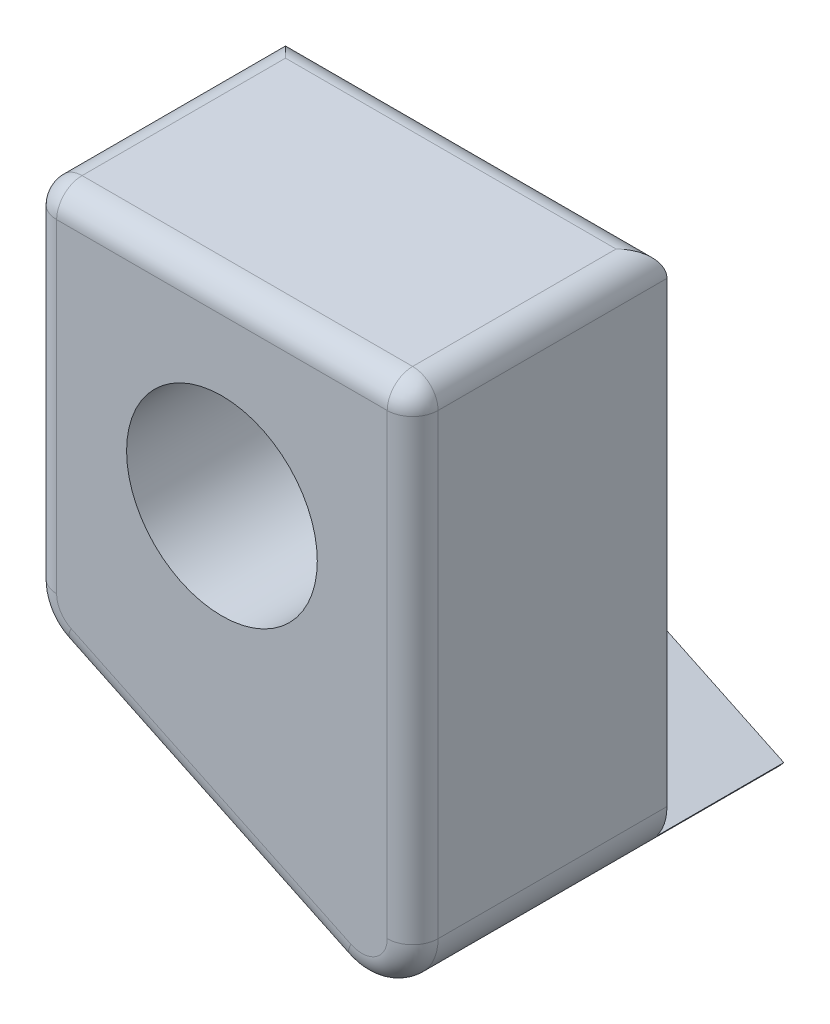
ISO-10303-21;
HEADER;
FILE_DESCRIPTION(('STEP AP214'),'2;1');
FILE_NAME('part.step','',(''),(''),'','','');
FILE_SCHEMA(('AUTOMOTIVE_DESIGN { 1 0 10303 214 1 1 1 1 }'));
ENDSEC;
DATA;
#1=APPLICATION_CONTEXT('core data for automotive mechanical design processes');
#2=APPLICATION_PROTOCOL_DEFINITION('international standard','automotive_design',2000,#1);
#3=PRODUCT_CONTEXT('',#1,'mechanical');
#4=PRODUCT('Part','Part','',(#3));
#5=PRODUCT_RELATED_PRODUCT_CATEGORY('part','',(#4));
#6=PRODUCT_DEFINITION_FORMATION('','',#4);
#7=PRODUCT_DEFINITION_CONTEXT('part definition',#1,'design');
#8=PRODUCT_DEFINITION('design','',#6,#7);
#9=PRODUCT_DEFINITION_SHAPE('','',#8);
#10=(LENGTH_UNIT() NAMED_UNIT(*) SI_UNIT(.MILLI.,.METRE.));
#11=(NAMED_UNIT(*) PLANE_ANGLE_UNIT() SI_UNIT($,.RADIAN.));
#12=(NAMED_UNIT(*) SI_UNIT($,.STERADIAN.) SOLID_ANGLE_UNIT());
#13=UNCERTAINTY_MEASURE_WITH_UNIT(LENGTH_MEASURE(1.E-05),#10,'distance_accuracy_value','');
#14=(GEOMETRIC_REPRESENTATION_CONTEXT(3) GLOBAL_UNCERTAINTY_ASSIGNED_CONTEXT((#13)) GLOBAL_UNIT_ASSIGNED_CONTEXT((#10,
#11,#12)) REPRESENTATION_CONTEXT('',''));
#15=CARTESIAN_POINT('',(0.,0.,0.));
#16=DIRECTION('',(0.,0.,1.));
#17=DIRECTION('',(1.,0.,0.));
#18=AXIS2_PLACEMENT_3D('',#15,#16,#17);
#19=CARTESIAN_POINT('',(0.,0.,10.));
#20=DIRECTION('',(0.,0.,-1.));
#21=DIRECTION('',(1.,0.,0.));
#22=AXIS2_PLACEMENT_3D('',#19,#20,#21);
#23=PLANE('',#22);
#24=CARTESIAN_POINT('',(0.,0.,10.));
#25=DIRECTION('',(0.,0.,1.));
#26=DIRECTION('',(1.,0.,0.));
#27=AXIS2_PLACEMENT_3D('',#24,#25,#26);
#28=CIRCLE('',#27,4.75);
#29=CARTESIAN_POINT('',(4.75,0.,10.));
#30=VERTEX_POINT('',#29);
#31=EDGE_CURVE('E232',#30,#30,#28,.F.);
#32=ORIENTED_EDGE('',*,*,#31,.F.);
#33=EDGE_LOOP('',(#32));
#34=FACE_BOUND('',#33,.T.);
#35=DIRECTION('',(0.,1.,0.));
#36=VECTOR('',#35,1.);
#37=CARTESIAN_POINT('',(7.5,7.5,10.));
#38=LINE('',#37,#36);
#39=CARTESIAN_POINT('',(7.5,-11.488406702993,10.));
#40=VERTEX_POINT('',#39);
#41=CARTESIAN_POINT('',(7.5,6.5,10.));
#42=VERTEX_POINT('',#41);
#43=EDGE_CURVE('E169',#40,#42,#38,.T.);
#44=ORIENTED_EDGE('',*,*,#43,.F.);
#45=CARTESIAN_POINT('',(5.5,-11.488406702993,10.));
#46=DIRECTION('',(0.,0.,1.));
#47=DIRECTION('',(1.,0.,0.));
#48=AXIS2_PLACEMENT_3D('',#45,#46,#47);
#49=CIRCLE('',#48,2.);
#50=CARTESIAN_POINT('',(7.09631730631528,-12.6933013280778,10.));
#51=VERTEX_POINT('',#50);
#52=EDGE_CURVE('E193',#51,#40,#49,.T.);
#53=ORIENTED_EDGE('',*,*,#52,.F.);
#54=DIRECTION('',(-0.902522036117792,0.430643674424453,0.));
#55=VECTOR('',#54,1.);
#56=CARTESIAN_POINT('',(-7.5,-5.72858305383451,10.));
#57=LINE('',#56,#55);
#58=CARTESIAN_POINT('',(-7.5,-5.72858305383451,10.));
#59=VERTEX_POINT('',#58);
#60=EDGE_CURVE('E150',#51,#59,#57,.T.);
#61=ORIENTED_EDGE('',*,*,#60,.T.);
#62=DIRECTION('',(0.,-1.,0.));
#63=VECTOR('',#62,1.);
#64=CARTESIAN_POINT('',(-7.5,0.,10.));
#65=LINE('',#64,#63);
#66=CARTESIAN_POINT('',(-7.5,6.5,10.));
#67=VERTEX_POINT('',#66);
#68=EDGE_CURVE('E164',#67,#59,#65,.T.);
#69=ORIENTED_EDGE('',*,*,#68,.F.);
#70=DIRECTION('',(-1.,0.,0.));
#71=VECTOR('',#70,1.);
#72=CARTESIAN_POINT('',(-7.5,6.5,10.));
#73=LINE('',#72,#71);
#74=EDGE_CURVE('E235',#42,#67,#73,.T.);
#75=ORIENTED_EDGE('',*,*,#74,.F.);
#76=EDGE_LOOP('',(#44,#53,#61,#69,#75));
#77=FACE_BOUND('',#76,.T.);
#78=ADVANCED_FACE('F41',(#34,#77),#23,.T.);
#79=CARTESIAN_POINT('',(0.,0.,20.));
#80=DIRECTION('',(0.,0.,-1.));
#81=DIRECTION('',(1.,0.,0.));
#82=AXIS2_PLACEMENT_3D('',#79,#80,#81);
#83=PLANE('',#82);
#84=DIRECTION('',(0.,-1.,0.));
#85=VECTOR('',#84,1.);
#86=CARTESIAN_POINT('',(-6.5,0.,20.));
#87=LINE('',#86,#85);
#88=CARTESIAN_POINT('',(-6.5,-6.23969229038362,20.));
#89=VERTEX_POINT('',#88);
#90=CARTESIAN_POINT('',(-6.5,6.5,20.));
#91=VERTEX_POINT('',#90);
#92=EDGE_CURVE('E208',#89,#91,#87,.F.);
#93=ORIENTED_EDGE('',*,*,#92,.F.);
#94=CARTESIAN_POINT('',(-5.5,-6.23969229038362,20.));
#95=DIRECTION('',(0.,0.,1.));
#96=DIRECTION('',(1.,0.,0.));
#97=AXIS2_PLACEMENT_3D('',#94,#95,#96);
#98=CIRCLE('',#97,1.);
#99=CARTESIAN_POINT('',(-5.93064367442445,-7.14221432650141,20.));
#100=VERTEX_POINT('',#99);
#101=EDGE_CURVE('E205',#100,#89,#98,.F.);
#102=ORIENTED_EDGE('',*,*,#101,.F.);
#103=DIRECTION('',(-0.902522036117792,0.430643674424453,0.));
#104=VECTOR('',#103,1.);
#105=CARTESIAN_POINT('',(-5.93064367442445,-7.14221432650141,20.));
#106=LINE('',#105,#104);
#107=CARTESIAN_POINT('',(5.06935632557555,-12.3909287391107,20.));
#108=VERTEX_POINT('',#107);
#109=EDGE_CURVE('E202',#108,#100,#106,.T.);
#110=ORIENTED_EDGE('',*,*,#109,.F.);
#111=CARTESIAN_POINT('',(5.5,-11.488406702993,20.));
#112=DIRECTION('',(0.,0.,1.));
#113=DIRECTION('',(1.,0.,0.));
#114=AXIS2_PLACEMENT_3D('',#111,#112,#113);
#115=CIRCLE('',#114,1.);
#116=CARTESIAN_POINT('',(6.5,-11.488406702993,20.));
#117=VERTEX_POINT('',#116);
#118=EDGE_CURVE('E211',#117,#108,#115,.F.);
#119=ORIENTED_EDGE('',*,*,#118,.F.);
#120=DIRECTION('',(0.,1.,0.));
#121=VECTOR('',#120,1.);
#122=CARTESIAN_POINT('',(6.5,0.,20.));
#123=LINE('',#122,#121);
#124=CARTESIAN_POINT('',(6.5,6.5,20.));
#125=VERTEX_POINT('',#124);
#126=EDGE_CURVE('E214',#125,#117,#123,.F.);
#127=ORIENTED_EDGE('',*,*,#126,.F.);
#128=DIRECTION('',(-1.,0.,0.));
#129=VECTOR('',#128,1.);
#130=CARTESIAN_POINT('',(0.,6.5,20.));
#131=LINE('',#130,#129);
#132=EDGE_CURVE('E217',#91,#125,#131,.F.);
#133=ORIENTED_EDGE('',*,*,#132,.F.);
#134=EDGE_LOOP('',(#93,#102,#110,#119,#127,#133));
#135=FACE_BOUND('',#134,.T.);
#136=CARTESIAN_POINT('',(0.,0.,20.));
#137=DIRECTION('',(0.,0.,1.));
#138=DIRECTION('',(1.,0.,0.));
#139=AXIS2_PLACEMENT_3D('',#136,#137,#138);
#140=CIRCLE('',#139,3.75);
#141=CARTESIAN_POINT('',(3.75,0.,20.));
#142=VERTEX_POINT('',#141);
#143=EDGE_CURVE('E166',#142,#142,#140,.T.);
#144=ORIENTED_EDGE('',*,*,#143,.F.);
#145=EDGE_LOOP('',(#144));
#146=FACE_BOUND('',#145,.T.);
#147=ADVANCED_FACE('F319',(#135,#146),#83,.F.);
#148=CARTESIAN_POINT('',(7.5,7.5,10.));
#149=DIRECTION('',(-1.,0.,0.));
#150=DIRECTION('',(0.,0.,-1.));
#151=AXIS2_PLACEMENT_3D('',#148,#149,#150);
#152=PLANE('',#151);
#153=DIRECTION('',(0.,0.,1.));
#154=VECTOR('',#153,1.);
#155=CARTESIAN_POINT('',(7.5,-11.488406702993,20.));
#156=LINE('',#155,#154);
#157=CARTESIAN_POINT('',(7.5,-11.488406702993,19.));
#158=VERTEX_POINT('',#157);
#159=EDGE_CURVE('E189',#40,#158,#156,.T.);
#160=ORIENTED_EDGE('',*,*,#159,.F.);
#161=ORIENTED_EDGE('',*,*,#43,.T.);
#162=DIRECTION('',(0.,0.,1.));
#163=VECTOR('',#162,1.);
#164=CARTESIAN_POINT('',(7.5,6.5,10.));
#165=LINE('',#164,#163);
#166=CARTESIAN_POINT('',(7.5,6.5,19.));
#167=VERTEX_POINT('',#166);
#168=EDGE_CURVE('E196',#167,#42,#165,.F.);
#169=ORIENTED_EDGE('',*,*,#168,.F.);
#170=DIRECTION('',(0.,1.,0.));
#171=VECTOR('',#170,1.);
#172=CARTESIAN_POINT('',(7.5,7.5,19.));
#173=LINE('',#172,#171);
#174=EDGE_CURVE('E199',#158,#167,#173,.T.);
#175=ORIENTED_EDGE('',*,*,#174,.F.);
#176=EDGE_LOOP('',(#160,#161,#169,#175));
#177=FACE_BOUND('',#176,.T.);
#178=ADVANCED_FACE('F325',(#177),#152,.F.);
#179=CARTESIAN_POINT('',(-7.5,7.5,10.));
#180=DIRECTION('',(0.,-1.,0.));
#181=DIRECTION('',(0.,0.,1.));
#182=AXIS2_PLACEMENT_3D('',#179,#180,#181);
#183=PLANE('',#182);
#184=DIRECTION('',(-1.,0.,0.));
#185=VECTOR('',#184,1.);
#186=CARTESIAN_POINT('',(-7.5,7.5,19.));
#187=LINE('',#186,#185);
#188=CARTESIAN_POINT('',(6.5,7.5,19.));
#189=VERTEX_POINT('',#188);
#190=CARTESIAN_POINT('',(-6.5,7.5,19.));
#191=VERTEX_POINT('',#190);
#192=EDGE_CURVE('E240',#189,#191,#187,.T.);
#193=ORIENTED_EDGE('',*,*,#192,.F.);
#194=DIRECTION('',(0.,0.,1.));
#195=VECTOR('',#194,1.);
#196=CARTESIAN_POINT('',(6.5,7.5,10.));
#197=LINE('',#196,#195);
#198=CARTESIAN_POINT('',(6.5,7.5,11.));
#199=VERTEX_POINT('',#198);
#200=EDGE_CURVE('E237',#199,#189,#197,.T.);
#201=ORIENTED_EDGE('',*,*,#200,.F.);
#202=DIRECTION('',(-1.,0.,0.));
#203=VECTOR('',#202,1.);
#204=CARTESIAN_POINT('',(7.5,7.5,11.));
#205=LINE('',#204,#203);
#206=CARTESIAN_POINT('',(-6.5,7.5,11.));
#207=VERTEX_POINT('',#206);
#208=EDGE_CURVE('E243',#207,#199,#205,.F.);
#209=ORIENTED_EDGE('',*,*,#208,.F.);
#210=DIRECTION('',(0.,0.,1.));
#211=VECTOR('',#210,1.);
#212=CARTESIAN_POINT('',(-6.5,7.5,10.));
#213=LINE('',#212,#211);
#214=EDGE_CURVE('E245',#191,#207,#213,.F.);
#215=ORIENTED_EDGE('',*,*,#214,.F.);
#216=EDGE_LOOP('',(#193,#201,#209,#215));
#217=FACE_BOUND('',#216,.T.);
#218=ADVANCED_FACE('F291',(#217),#183,.F.);
#219=CARTESIAN_POINT('',(-7.5,0.,10.));
#220=DIRECTION('',(1.,0.,0.));
#221=DIRECTION('',(0.,0.,1.));
#222=AXIS2_PLACEMENT_3D('',#219,#220,#221);
#223=PLANE('',#222);
#224=DIRECTION('',(0.,0.,1.));
#225=VECTOR('',#224,1.);
#226=CARTESIAN_POINT('',(-7.5,6.5,10.));
#227=LINE('',#226,#225);
#228=CARTESIAN_POINT('',(-7.5,6.5,19.));
#229=VERTEX_POINT('',#228);
#230=EDGE_CURVE('E223',#67,#229,#227,.T.);
#231=ORIENTED_EDGE('',*,*,#230,.F.);
#232=ORIENTED_EDGE('',*,*,#68,.T.);
#233=DIRECTION('',(0.,0.,1.));
#234=VECTOR('',#233,1.);
#235=CARTESIAN_POINT('',(-7.5,-5.72858305383451,5.));
#236=LINE('',#235,#234);
#237=CARTESIAN_POINT('',(-7.5,-5.72858305383451,5.));
#238=VERTEX_POINT('',#237);
#239=EDGE_CURVE('E145',#238,#59,#236,.T.);
#240=ORIENTED_EDGE('',*,*,#239,.F.);
#241=DIRECTION('',(0.,-1.,0.));
#242=VECTOR('',#241,1.);
#243=CARTESIAN_POINT('',(-7.5,-7.50139295317218,5.));
#244=LINE('',#243,#242);
#245=CARTESIAN_POINT('',(-7.5,-6.23969229038362,5.));
#246=VERTEX_POINT('',#245);
#247=EDGE_CURVE('E149',#238,#246,#244,.T.);
#248=ORIENTED_EDGE('',*,*,#247,.T.);
#249=DIRECTION('',(0.,0.,1.));
#250=VECTOR('',#249,1.);
#251=CARTESIAN_POINT('',(-7.5,-6.23969229038362,5.));
#252=LINE('',#251,#250);
#253=CARTESIAN_POINT('',(-7.5,-6.23969229038362,19.));
#254=VERTEX_POINT('',#253);
#255=EDGE_CURVE('E184',#254,#246,#252,.F.);
#256=ORIENTED_EDGE('',*,*,#255,.F.);
#257=DIRECTION('',(0.,-1.,0.));
#258=VECTOR('',#257,1.);
#259=CARTESIAN_POINT('',(-7.5,0.,19.));
#260=LINE('',#259,#258);
#261=EDGE_CURVE('E226',#229,#254,#260,.T.);
#262=ORIENTED_EDGE('',*,*,#261,.F.);
#263=EDGE_LOOP('',(#231,#232,#240,#248,#256,#262));
#264=FACE_BOUND('',#263,.T.);
#265=ADVANCED_FACE('F162',(#264),#223,.F.);
#266=CARTESIAN_POINT('',(0.,0.,10.));
#267=DIRECTION('',(0.,0.,1.));
#268=DIRECTION('',(-1.,0.,0.));
#269=AXIS2_PLACEMENT_3D('',#266,#267,#268);
#270=CYLINDRICAL_SURFACE('',#269,3.75);
#271=CARTESIAN_POINT('',(0.,0.,11.));
#272=DIRECTION('',(0.,0.,1.));
#273=DIRECTION('',(1.,0.,0.));
#274=AXIS2_PLACEMENT_3D('',#271,#272,#273);
#275=CIRCLE('',#274,3.75);
#276=CARTESIAN_POINT('',(3.75,0.,11.));
#277=VERTEX_POINT('',#276);
#278=EDGE_CURVE('E11',#277,#277,#275,.T.);
#279=ORIENTED_EDGE('',*,*,#278,.F.);
#280=EDGE_LOOP('',(#279));
#281=FACE_BOUND('',#280,.T.);
#282=ORIENTED_EDGE('',*,*,#143,.T.);
#283=EDGE_LOOP('',(#282));
#284=FACE_BOUND('',#283,.T.);
#285=ADVANCED_FACE('F330',(#281,#284),#270,.F.);
#286=CARTESIAN_POINT('',(7.5,-14.6587307885485,10.));
#287=DIRECTION('',(-0.430643674424453,-0.902522036117793,0.));
#288=DIRECTION('',(0.902522036117792,-0.430643674424453,0.));
#289=AXIS2_PLACEMENT_3D('',#286,#287,#288);
#290=PLANE('',#289);
#291=DIRECTION('',(0.,0.,1.));
#292=VECTOR('',#291,1.);
#293=CARTESIAN_POINT('',(-6.36128734884891,-8.0447363626192,20.));
#294=LINE('',#293,#292);
#295=CARTESIAN_POINT('',(-6.36128734884891,-8.0447363626192,5.));
#296=VERTEX_POINT('',#295);
#297=CARTESIAN_POINT('',(-6.36128734884891,-8.0447363626192,19.));
#298=VERTEX_POINT('',#297);
#299=EDGE_CURVE('E181',#296,#298,#294,.T.);
#300=ORIENTED_EDGE('',*,*,#299,.F.);
#301=DIRECTION('',(0.902522036117793,-0.430643674424453,0.));
#302=VECTOR('',#301,1.);
#303=CARTESIAN_POINT('',(7.5,-14.6587307885485,5.));
#304=LINE('',#303,#302);
#305=CARTESIAN_POINT('',(4.63871265115109,-13.2934507752285,5.));
#306=VERTEX_POINT('',#305);
#307=EDGE_CURVE('E159',#296,#306,#304,.T.);
#308=ORIENTED_EDGE('',*,*,#307,.T.);
#309=DIRECTION('',(0.,0.,1.));
#310=VECTOR('',#309,1.);
#311=CARTESIAN_POINT('',(4.63871265115109,-13.2934507752285,5.));
#312=LINE('',#311,#310);
#313=CARTESIAN_POINT('',(4.63871265115109,-13.2934507752285,19.));
#314=VERTEX_POINT('',#313);
#315=EDGE_CURVE('E178',#314,#306,#312,.F.);
#316=ORIENTED_EDGE('',*,*,#315,.F.);
#317=DIRECTION('',(-0.902522036117792,0.430643674424453,0.));
#318=VECTOR('',#317,1.);
#319=CARTESIAN_POINT('',(4.63871265115109,-13.2934507752285,19.));
#320=LINE('',#319,#318);
#321=EDGE_CURVE('E50',#298,#314,#320,.F.);
#322=ORIENTED_EDGE('',*,*,#321,.F.);
#323=EDGE_LOOP('',(#300,#308,#316,#322));
#324=FACE_BOUND('',#323,.T.);
#325=ADVANCED_FACE('F281',(#324),#290,.T.);
#326=CARTESIAN_POINT('',(-7.5,-5.72858305383451,5.));
#327=DIRECTION('',(-0.430643674424453,-0.902522036117792,0.));
#328=DIRECTION('',(0.902522036117793,-0.430643674424453,0.));
#329=AXIS2_PLACEMENT_3D('',#326,#327,#328);
#330=PLANE('',#329);
#331=DIRECTION('',(-0.902522036117792,0.430643674424453,0.));
#332=VECTOR('',#331,1.);
#333=CARTESIAN_POINT('',(-7.5,-5.72858305383451,5.));
#334=LINE('',#333,#332);
#335=CARTESIAN_POINT('',(7.09631730631527,-12.6933013280778,5.));
#336=VERTEX_POINT('',#335);
#337=EDGE_CURVE('E140',#336,#238,#334,.T.);
#338=ORIENTED_EDGE('',*,*,#337,.T.);
#339=ORIENTED_EDGE('',*,*,#239,.T.);
#340=ORIENTED_EDGE('',*,*,#60,.F.);
#341=DIRECTION('',(0.,0.,-1.));
#342=VECTOR('',#341,1.);
#343=CARTESIAN_POINT('',(7.09631730631528,-12.6933013280778,5.));
#344=LINE('',#343,#342);
#345=EDGE_CURVE('E147',#336,#51,#344,.F.);
#346=ORIENTED_EDGE('',*,*,#345,.F.);
#347=EDGE_LOOP('',(#338,#339,#340,#346));
#348=FACE_BOUND('',#347,.T.);
#349=ADVANCED_FACE('F142',(#348),#330,.F.);
#350=CARTESIAN_POINT('',(0.,0.,5.));
#351=DIRECTION('',(0.,0.,1.));
#352=DIRECTION('',(-1.,0.,0.));
#353=AXIS2_PLACEMENT_3D('',#350,#351,#352);
#354=PLANE('',#353);
#355=ORIENTED_EDGE('',*,*,#247,.F.);
#356=ORIENTED_EDGE('',*,*,#337,.F.);
#357=CARTESIAN_POINT('',(5.5,-11.488406702993,5.));
#358=DIRECTION('',(0.,0.,-1.));
#359=DIRECTION('',(-1.,0.,0.));
#360=AXIS2_PLACEMENT_3D('',#357,#358,#359);
#361=CIRCLE('',#360,2.);
#362=EDGE_CURVE('E186',#306,#336,#361,.F.);
#363=ORIENTED_EDGE('',*,*,#362,.F.);
#364=ORIENTED_EDGE('',*,*,#307,.F.);
#365=CARTESIAN_POINT('',(-5.5,-6.23969229038362,5.));
#366=DIRECTION('',(0.,0.,-1.));
#367=DIRECTION('',(-1.,0.,0.));
#368=AXIS2_PLACEMENT_3D('',#365,#366,#367);
#369=CIRCLE('',#368,2.);
#370=EDGE_CURVE('E155',#246,#296,#369,.F.);
#371=ORIENTED_EDGE('',*,*,#370,.F.);
#372=EDGE_LOOP('',(#355,#356,#363,#364,#371));
#373=FACE_BOUND('',#372,.T.);
#374=ADVANCED_FACE('F153',(#373),#354,.F.);
#375=CARTESIAN_POINT('',(-5.5,-6.23969229038362,10.));
#376=DIRECTION('',(0.,0.,-1.));
#377=DIRECTION('',(1.,0.,0.));
#378=AXIS2_PLACEMENT_3D('',#375,#376,#377);
#379=CYLINDRICAL_SURFACE('',#378,2.);
#380=ORIENTED_EDGE('',*,*,#255,.T.);
#381=ORIENTED_EDGE('',*,*,#370,.T.);
#382=ORIENTED_EDGE('',*,*,#299,.T.);
#383=CARTESIAN_POINT('',(-5.5,-6.23969229038362,19.));
#384=DIRECTION('',(0.,0.,1.));
#385=DIRECTION('',(1.,0.,0.));
#386=AXIS2_PLACEMENT_3D('',#383,#384,#385);
#387=CIRCLE('',#386,2.);
#388=EDGE_CURVE('E229',#254,#298,#387,.T.);
#389=ORIENTED_EDGE('',*,*,#388,.F.);
#390=EDGE_LOOP('',(#380,#381,#382,#389));
#391=FACE_BOUND('',#390,.T.);
#392=ADVANCED_FACE('F284',(#391),#379,.T.);
#393=CARTESIAN_POINT('',(5.5,-11.488406702993,10.));
#394=DIRECTION('',(0.,0.,-1.));
#395=DIRECTION('',(1.,0.,0.));
#396=AXIS2_PLACEMENT_3D('',#393,#394,#395);
#397=CYLINDRICAL_SURFACE('',#396,2.);
#398=ORIENTED_EDGE('',*,*,#315,.T.);
#399=ORIENTED_EDGE('',*,*,#362,.T.);
#400=ORIENTED_EDGE('',*,*,#345,.T.);
#401=ORIENTED_EDGE('',*,*,#52,.T.);
#402=ORIENTED_EDGE('',*,*,#159,.T.);
#403=CARTESIAN_POINT('',(5.5,-11.488406702993,19.));
#404=DIRECTION('',(0.,0.,1.));
#405=DIRECTION('',(1.,0.,0.));
#406=AXIS2_PLACEMENT_3D('',#403,#404,#405);
#407=CIRCLE('',#406,2.);
#408=EDGE_CURVE('E220',#314,#158,#407,.T.);
#409=ORIENTED_EDGE('',*,*,#408,.F.);
#410=EDGE_LOOP('',(#398,#399,#400,#401,#402,#409));
#411=FACE_BOUND('',#410,.T.);
#412=ADVANCED_FACE('F275',(#411),#397,.T.);
#413=CARTESIAN_POINT('',(-6.5,6.5,10.));
#414=DIRECTION('',(0.,0.,1.));
#415=DIRECTION('',(-1.,0.,0.));
#416=AXIS2_PLACEMENT_3D('',#413,#414,#415);
#417=CYLINDRICAL_SURFACE('',#416,1.);
#418=CARTESIAN_POINT('',(-6.5,6.5,19.));
#419=DIRECTION('',(0.,0.,-1.));
#420=DIRECTION('',(-1.,0.,0.));
#421=AXIS2_PLACEMENT_3D('',#418,#419,#420);
#422=CIRCLE('',#421,1.);
#423=EDGE_CURVE('E267',#229,#191,#422,.T.);
#424=ORIENTED_EDGE('',*,*,#423,.T.);
#425=ORIENTED_EDGE('',*,*,#214,.T.);
#426=CARTESIAN_POINT('',(-6.5,6.5,11.));
#427=DIRECTION('',(0.707106781186547,0.,-0.707106781186547));
#428=DIRECTION('',(0.707106781186547,0.,0.707106781186547));
#429=AXIS2_PLACEMENT_3D('',#426,#427,#428);
#430=ELLIPSE('',#429,1.41421356237309,1.);
#431=EDGE_CURVE('E58',#207,#67,#430,.F.);
#432=ORIENTED_EDGE('',*,*,#431,.T.);
#433=ORIENTED_EDGE('',*,*,#230,.T.);
#434=EDGE_LOOP('',(#424,#425,#432,#433));
#435=FACE_BOUND('',#434,.T.);
#436=ADVANCED_FACE('F286',(#435),#417,.T.);
#437=CARTESIAN_POINT('',(-6.5,0.,19.));
#438=DIRECTION('',(0.,-1.,0.));
#439=DIRECTION('',(0.,0.,1.));
#440=AXIS2_PLACEMENT_3D('',#437,#438,#439);
#441=CYLINDRICAL_SURFACE('',#440,1.);
#442=CARTESIAN_POINT('',(-6.5,6.5,19.));
#443=DIRECTION('',(0.,-1.,0.));
#444=DIRECTION('',(0.,0.,-1.));
#445=AXIS2_PLACEMENT_3D('',#442,#443,#444);
#446=CIRCLE('',#445,1.);
#447=EDGE_CURVE('E265',#91,#229,#446,.T.);
#448=ORIENTED_EDGE('',*,*,#447,.T.);
#449=ORIENTED_EDGE('',*,*,#261,.T.);
#450=CARTESIAN_POINT('',(-6.5,-6.23969229038362,19.));
#451=DIRECTION('',(0.,1.,0.));
#452=DIRECTION('',(0.,0.,1.));
#453=AXIS2_PLACEMENT_3D('',#450,#451,#452);
#454=CIRCLE('',#453,1.);
#455=EDGE_CURVE('E45',#254,#89,#454,.T.);
#456=ORIENTED_EDGE('',*,*,#455,.T.);
#457=ORIENTED_EDGE('',*,*,#92,.T.);
#458=EDGE_LOOP('',(#448,#449,#456,#457));
#459=FACE_BOUND('',#458,.T.);
#460=ADVANCED_FACE('F315',(#459),#441,.T.);
#461=CARTESIAN_POINT('',(-5.5,-6.23969229038362,19.));
#462=DIRECTION('',(0.,0.,-1.));
#463=DIRECTION('',(1.,0.,0.));
#464=AXIS2_PLACEMENT_3D('',#461,#462,#463);
#465=DEGENERATE_TOROIDAL_SURFACE('',#464,1.,1.,.T.);
#466=ORIENTED_EDGE('',*,*,#455,.F.);
#467=ORIENTED_EDGE('',*,*,#388,.T.);
#468=CARTESIAN_POINT('',(-5.93064367442445,-7.14221432650141,19.));
#469=DIRECTION('',(-0.902522036117793,0.430643674424453,0.));
#470=DIRECTION('',(0.430643674424453,0.902522036117793,0.));
#471=AXIS2_PLACEMENT_3D('',#468,#469,#470);
#472=CIRCLE('',#471,1.);
#473=EDGE_CURVE('E263',#298,#100,#472,.T.);
#474=ORIENTED_EDGE('',*,*,#473,.T.);
#475=ORIENTED_EDGE('',*,*,#101,.T.);
#476=EDGE_LOOP('',(#466,#467,#474,#475));
#477=FACE_BOUND('',#476,.T.);
#478=ADVANCED_FACE('F307',(#477),#465,.T.);
#479=CARTESIAN_POINT('',(0.,6.5,11.));
#480=DIRECTION('',(1.,0.,0.));
#481=DIRECTION('',(0.,0.,1.));
#482=AXIS2_PLACEMENT_3D('',#479,#480,#481);
#483=CYLINDRICAL_SURFACE('',#482,1.);
#484=ORIENTED_EDGE('',*,*,#431,.F.);
#485=ORIENTED_EDGE('',*,*,#208,.T.);
#486=CARTESIAN_POINT('',(6.5,6.5,11.));
#487=DIRECTION('',(-0.707106781186547,0.,-0.707106781186547));
#488=DIRECTION('',(-0.707106781186547,0.,0.707106781186547));
#489=AXIS2_PLACEMENT_3D('',#486,#487,#488);
#490=ELLIPSE('',#489,1.41421356237309,1.);
#491=EDGE_CURVE('E261',#199,#42,#490,.T.);
#492=ORIENTED_EDGE('',*,*,#491,.T.);
#493=ORIENTED_EDGE('',*,*,#74,.T.);
#494=EDGE_LOOP('',(#484,#485,#492,#493));
#495=FACE_BOUND('',#494,.T.);
#496=ADVANCED_FACE('F304',(#495),#483,.T.);
#497=CARTESIAN_POINT('',(-6.5,6.5,19.));
#498=DIRECTION('',(-1.,0.,0.));
#499=DIRECTION('',(0.,0.,-1.));
#500=AXIS2_PLACEMENT_3D('',#497,#498,#499);
#501=SPHERICAL_SURFACE('',#500,1.);
#502=ORIENTED_EDGE('',*,*,#447,.F.);
#503=CARTESIAN_POINT('',(-6.5,6.5,19.));
#504=DIRECTION('',(1.,0.,0.));
#505=DIRECTION('',(0.,0.,-1.));
#506=AXIS2_PLACEMENT_3D('',#503,#504,#505);
#507=CIRCLE('',#506,1.);
#508=EDGE_CURVE('E66',#91,#191,#507,.F.);
#509=ORIENTED_EDGE('',*,*,#508,.T.);
#510=ORIENTED_EDGE('',*,*,#423,.F.);
#511=EDGE_LOOP('',(#502,#509,#510));
#512=FACE_BOUND('',#511,.T.);
#513=ADVANCED_FACE('F306',(#512),#501,.T.);
#514=CARTESIAN_POINT('',(-3.87579306982008,-8.12269832506014,19.));
#515=DIRECTION('',(0.902522036117792,-0.430643674424453,0.));
#516=DIRECTION('',(0.430643674424453,0.902522036117793,0.));
#517=AXIS2_PLACEMENT_3D('',#514,#515,#516);
#518=CYLINDRICAL_SURFACE('',#517,1.);
#519=ORIENTED_EDGE('',*,*,#473,.F.);
#520=ORIENTED_EDGE('',*,*,#321,.T.);
#521=CARTESIAN_POINT('',(5.06935632557555,-12.3909287391107,19.));
#522=DIRECTION('',(-0.902522036117793,0.430643674424453,0.));
#523=DIRECTION('',(0.430643674424453,0.902522036117793,0.));
#524=AXIS2_PLACEMENT_3D('',#521,#522,#523);
#525=CIRCLE('',#524,1.);
#526=EDGE_CURVE('E258',#314,#108,#525,.T.);
#527=ORIENTED_EDGE('',*,*,#526,.T.);
#528=ORIENTED_EDGE('',*,*,#109,.T.);
#529=EDGE_LOOP('',(#519,#520,#527,#528));
#530=FACE_BOUND('',#529,.T.);
#531=ADVANCED_FACE('F313',(#530),#518,.T.);
#532=CARTESIAN_POINT('',(6.5,6.5,10.));
#533=DIRECTION('',(0.,0.,1.));
#534=DIRECTION('',(-1.,0.,0.));
#535=AXIS2_PLACEMENT_3D('',#532,#533,#534);
#536=CYLINDRICAL_SURFACE('',#535,1.);
#537=ORIENTED_EDGE('',*,*,#491,.F.);
#538=ORIENTED_EDGE('',*,*,#200,.T.);
#539=CARTESIAN_POINT('',(6.5,6.5,19.));
#540=DIRECTION('',(0.,0.,-1.));
#541=DIRECTION('',(-1.,0.,0.));
#542=AXIS2_PLACEMENT_3D('',#539,#540,#541);
#543=CIRCLE('',#542,1.);
#544=EDGE_CURVE('E255',#189,#167,#543,.T.);
#545=ORIENTED_EDGE('',*,*,#544,.T.);
#546=ORIENTED_EDGE('',*,*,#168,.T.);
#547=EDGE_LOOP('',(#537,#538,#545,#546));
#548=FACE_BOUND('',#547,.T.);
#549=ADVANCED_FACE('F302',(#548),#536,.T.);
#550=CARTESIAN_POINT('',(-7.5,6.5,19.));
#551=DIRECTION('',(-1.,0.,0.));
#552=DIRECTION('',(0.,0.,-1.));
#553=AXIS2_PLACEMENT_3D('',#550,#551,#552);
#554=CYLINDRICAL_SURFACE('',#553,1.);
#555=ORIENTED_EDGE('',*,*,#508,.F.);
#556=ORIENTED_EDGE('',*,*,#132,.T.);
#557=CARTESIAN_POINT('',(6.5,6.5,19.));
#558=DIRECTION('',(-1.,0.,0.));
#559=DIRECTION('',(0.,1.,0.));
#560=AXIS2_PLACEMENT_3D('',#557,#558,#559);
#561=CIRCLE('',#560,1.);
#562=EDGE_CURVE('E253',#125,#189,#561,.T.);
#563=ORIENTED_EDGE('',*,*,#562,.T.);
#564=ORIENTED_EDGE('',*,*,#192,.T.);
#565=EDGE_LOOP('',(#555,#556,#563,#564));
#566=FACE_BOUND('',#565,.T.);
#567=ADVANCED_FACE('F294',(#566),#554,.T.);
#568=CARTESIAN_POINT('',(5.5,-11.488406702993,19.));
#569=DIRECTION('',(0.,0.,-1.));
#570=DIRECTION('',(1.,0.,0.));
#571=AXIS2_PLACEMENT_3D('',#568,#569,#570);
#572=DEGENERATE_TOROIDAL_SURFACE('',#571,1.,1.,.T.);
#573=ORIENTED_EDGE('',*,*,#526,.F.);
#574=ORIENTED_EDGE('',*,*,#408,.T.);
#575=CARTESIAN_POINT('',(6.5,-11.488406702993,19.));
#576=DIRECTION('',(0.,-1.,0.));
#577=DIRECTION('',(0.,0.,-1.));
#578=AXIS2_PLACEMENT_3D('',#575,#576,#577);
#579=CIRCLE('',#578,1.);
#580=EDGE_CURVE('E251',#158,#117,#579,.T.);
#581=ORIENTED_EDGE('',*,*,#580,.T.);
#582=ORIENTED_EDGE('',*,*,#118,.T.);
#583=EDGE_LOOP('',(#573,#574,#581,#582));
#584=FACE_BOUND('',#583,.T.);
#585=ADVANCED_FACE('F350',(#584),#572,.T.);
#586=CARTESIAN_POINT('',(6.5,6.5,19.));
#587=DIRECTION('',(0.,1.,0.));
#588=DIRECTION('',(0.,0.,-1.));
#589=AXIS2_PLACEMENT_3D('',#586,#587,#588);
#590=SPHERICAL_SURFACE('',#589,1.);
#591=ORIENTED_EDGE('',*,*,#562,.F.);
#592=CARTESIAN_POINT('',(6.5,6.5,19.));
#593=DIRECTION('',(0.,-1.,0.));
#594=DIRECTION('',(0.,0.,-1.));
#595=AXIS2_PLACEMENT_3D('',#592,#593,#594);
#596=CIRCLE('',#595,1.);
#597=EDGE_CURVE('E249',#125,#167,#596,.F.);
#598=ORIENTED_EDGE('',*,*,#597,.T.);
#599=ORIENTED_EDGE('',*,*,#544,.F.);
#600=EDGE_LOOP('',(#591,#598,#599));
#601=FACE_BOUND('',#600,.T.);
#602=ADVANCED_FACE('F300',(#601),#590,.T.);
#603=CARTESIAN_POINT('',(6.5,7.5,19.));
#604=DIRECTION('',(0.,1.,0.));
#605=DIRECTION('',(0.,0.,-1.));
#606=AXIS2_PLACEMENT_3D('',#603,#604,#605);
#607=CYLINDRICAL_SURFACE('',#606,1.);
#608=ORIENTED_EDGE('',*,*,#580,.F.);
#609=ORIENTED_EDGE('',*,*,#174,.T.);
#610=ORIENTED_EDGE('',*,*,#597,.F.);
#611=ORIENTED_EDGE('',*,*,#126,.T.);
#612=EDGE_LOOP('',(#608,#609,#610,#611));
#613=FACE_BOUND('',#612,.T.);
#614=ADVANCED_FACE('F344',(#613),#607,.T.);
#615=CARTESIAN_POINT('',(0.,0.,11.));
#616=DIRECTION('',(0.,0.,-1.));
#617=DIRECTION('',(1.,0.,0.));
#618=AXIS2_PLACEMENT_3D('',#615,#616,#617);
#619=TOROIDAL_SURFACE('',#618,4.75,1.);
#620=ORIENTED_EDGE('',*,*,#31,.T.);
#621=EDGE_LOOP('',(#620));
#622=FACE_BOUND('',#621,.T.);
#623=ORIENTED_EDGE('',*,*,#278,.T.);
#624=EDGE_LOOP('',(#623));
#625=FACE_BOUND('',#624,.T.);
#626=ADVANCED_FACE('F43',(#622,#625),#619,.T.);
#627=CLOSED_SHELL('',(#78,#147,#178,#218,#265,#285,#325,#349,#374,#392,#412,#436,#460,#478,#496,
#513,#531,#549,#567,#585,#602,#614,#626));
#628=MANIFOLD_SOLID_BREP('B2',#627);
#629=ADVANCED_BREP_SHAPE_REPRESENTATION('',(#18,#628),#14);
#630=SHAPE_DEFINITION_REPRESENTATION(#9,#629);
ENDSEC;
END-ISO-10303-21;
